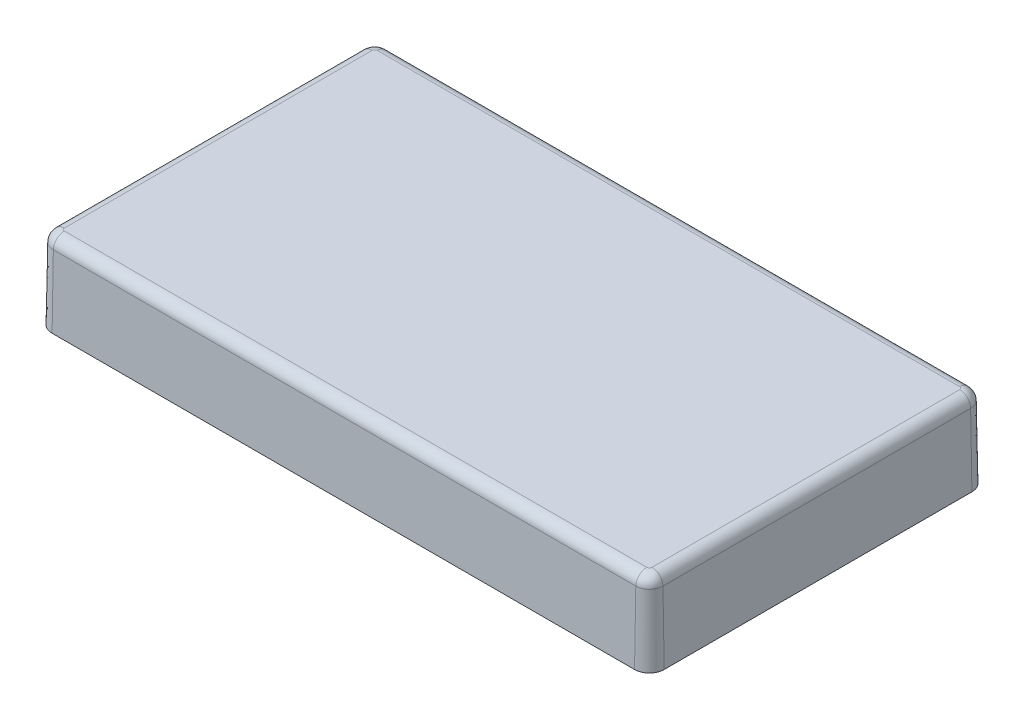
ISO-10303-21;
HEADER;
FILE_DESCRIPTION(('STEP AP214'),'2;1');
FILE_NAME('part.step','',(''),(''),'','','');
FILE_SCHEMA(('AUTOMOTIVE_DESIGN { 1 0 10303 214 1 1 1 1 }'));
ENDSEC;
DATA;
#1=APPLICATION_CONTEXT('core data for automotive mechanical design processes');
#2=APPLICATION_PROTOCOL_DEFINITION('international standard','automotive_design',2000,#1);
#3=PRODUCT_CONTEXT('',#1,'mechanical');
#4=PRODUCT('Part','Part','',(#3));
#5=PRODUCT_RELATED_PRODUCT_CATEGORY('part','',(#4));
#6=PRODUCT_DEFINITION_FORMATION('','',#4);
#7=PRODUCT_DEFINITION_CONTEXT('part definition',#1,'design');
#8=PRODUCT_DEFINITION('design','',#6,#7);
#9=PRODUCT_DEFINITION_SHAPE('','',#8);
#10=(LENGTH_UNIT() NAMED_UNIT(*) SI_UNIT(.MILLI.,.METRE.));
#11=(NAMED_UNIT(*) PLANE_ANGLE_UNIT() SI_UNIT($,.RADIAN.));
#12=(NAMED_UNIT(*) SI_UNIT($,.STERADIAN.) SOLID_ANGLE_UNIT());
#13=UNCERTAINTY_MEASURE_WITH_UNIT(LENGTH_MEASURE(1.E-05),#10,'distance_accuracy_value','');
#14=(GEOMETRIC_REPRESENTATION_CONTEXT(3) GLOBAL_UNCERTAINTY_ASSIGNED_CONTEXT((#13)) GLOBAL_UNIT_ASSIGNED_CONTEXT((#10,
#11,#12)) REPRESENTATION_CONTEXT('',''));
#15=CARTESIAN_POINT('',(0.,0.,0.));
#16=DIRECTION('',(0.,0.,1.));
#17=DIRECTION('',(1.,0.,0.));
#18=AXIS2_PLACEMENT_3D('',#15,#16,#17);
#19=CARTESIAN_POINT('',(0.,10.,0.));
#20=DIRECTION('',(0.,1.,0.));
#21=DIRECTION('',(0.,0.,1.));
#22=AXIS2_PLACEMENT_3D('',#19,#20,#21);
#23=PLANE('',#22);
#24=CARTESIAN_POINT('',(53.,10.,-28.));
#25=DIRECTION('',(0.,1.,0.));
#26=DIRECTION('',(0.,0.,1.));
#27=AXIS2_PLACEMENT_3D('',#24,#25,#26);
#28=CIRCLE('',#27,0.697897941040891);
#29=CARTESIAN_POINT('',(53.6978979410409,10.,-28.));
#30=VERTEX_POINT('',#29);
#31=CARTESIAN_POINT('',(53.,10.,-28.6978979410409));
#32=VERTEX_POINT('',#31);
#33=EDGE_CURVE('E307',#30,#32,#28,.T.);
#34=ORIENTED_EDGE('',*,*,#33,.T.);
#35=DIRECTION('',(1.,0.,0.));
#36=VECTOR('',#35,1.);
#37=CARTESIAN_POINT('',(-53.,10.,-28.6978979410409));
#38=LINE('',#37,#36);
#39=CARTESIAN_POINT('',(-53.,10.,-28.6978979410409));
#40=VERTEX_POINT('',#39);
#41=EDGE_CURVE('E304',#32,#40,#38,.F.);
#42=ORIENTED_EDGE('',*,*,#41,.T.);
#43=CARTESIAN_POINT('',(-53.,10.,-28.));
#44=DIRECTION('',(0.,1.,0.));
#45=DIRECTION('',(0.,0.,1.));
#46=AXIS2_PLACEMENT_3D('',#43,#44,#45);
#47=CIRCLE('',#46,0.697897941040895);
#48=CARTESIAN_POINT('',(-53.6978979410409,10.,-28.));
#49=VERTEX_POINT('',#48);
#50=EDGE_CURVE('E301',#40,#49,#47,.T.);
#51=ORIENTED_EDGE('',*,*,#50,.T.);
#52=DIRECTION('',(0.,0.,-1.));
#53=VECTOR('',#52,1.);
#54=CARTESIAN_POINT('',(-53.6978979410409,10.,-28.));
#55=LINE('',#54,#53);
#56=CARTESIAN_POINT('',(-53.6978979410409,10.,28.));
#57=VERTEX_POINT('',#56);
#58=EDGE_CURVE('E298',#49,#57,#55,.F.);
#59=ORIENTED_EDGE('',*,*,#58,.T.);
#60=CARTESIAN_POINT('',(-53.,10.,28.));
#61=DIRECTION('',(0.,1.,0.));
#62=DIRECTION('',(0.,0.,1.));
#63=AXIS2_PLACEMENT_3D('',#60,#61,#62);
#64=CIRCLE('',#63,0.697897941040895);
#65=CARTESIAN_POINT('',(-53.,10.,28.6978979410409));
#66=VERTEX_POINT('',#65);
#67=EDGE_CURVE('E295',#57,#66,#64,.T.);
#68=ORIENTED_EDGE('',*,*,#67,.T.);
#69=DIRECTION('',(-1.,0.,0.));
#70=VECTOR('',#69,1.);
#71=CARTESIAN_POINT('',(-53.,10.,28.6978979410409));
#72=LINE('',#71,#70);
#73=CARTESIAN_POINT('',(53.,10.,28.6978979410409));
#74=VERTEX_POINT('',#73);
#75=EDGE_CURVE('E292',#66,#74,#72,.F.);
#76=ORIENTED_EDGE('',*,*,#75,.T.);
#77=CARTESIAN_POINT('',(53.,10.,28.));
#78=DIRECTION('',(0.,1.,0.));
#79=DIRECTION('',(0.,0.,1.));
#80=AXIS2_PLACEMENT_3D('',#77,#78,#79);
#81=CIRCLE('',#80,0.697897941040891);
#82=CARTESIAN_POINT('',(53.6978979410409,10.,28.));
#83=VERTEX_POINT('',#82);
#84=EDGE_CURVE('E41',#74,#83,#81,.T.);
#85=ORIENTED_EDGE('',*,*,#84,.T.);
#86=DIRECTION('',(0.,0.,1.));
#87=VECTOR('',#86,1.);
#88=CARTESIAN_POINT('',(53.6978979410409,10.,-28.));
#89=LINE('',#88,#87);
#90=EDGE_CURVE('E11',#83,#30,#89,.F.);
#91=ORIENTED_EDGE('',*,*,#90,.T.);
#92=EDGE_LOOP('',(#34,#42,#51,#59,#68,#76,#85,#91));
#93=FACE_BOUND('',#92,.T.);
#94=DIRECTION('',(0.,0.,1.));
#95=VECTOR('',#94,1.);
#96=CARTESIAN_POINT('',(55.6982025971287,10.,-28.));
#97=LINE('',#96,#95);
#98=CARTESIAN_POINT('',(55.6982025971287,10.,28.));
#99=VERTEX_POINT('',#98);
#100=CARTESIAN_POINT('',(55.6982025971287,10.,-28.));
#101=VERTEX_POINT('',#100);
#102=EDGE_CURVE('E249',#99,#101,#97,.F.);
#103=ORIENTED_EDGE('',*,*,#102,.F.);
#104=CARTESIAN_POINT('',(53.,10.,28.));
#105=DIRECTION('',(0.,1.,0.));
#106=DIRECTION('',(0.,0.,1.));
#107=AXIS2_PLACEMENT_3D('',#104,#105,#106);
#108=CIRCLE('',#107,2.69820259712871);
#109=CARTESIAN_POINT('',(53.,10.,30.6982025971287));
#110=VERTEX_POINT('',#109);
#111=EDGE_CURVE('E311',#110,#99,#108,.T.);
#112=ORIENTED_EDGE('',*,*,#111,.F.);
#113=DIRECTION('',(-1.,0.,0.));
#114=VECTOR('',#113,1.);
#115=CARTESIAN_POINT('',(-53.,10.,30.6982025971287));
#116=LINE('',#115,#114);
#117=CARTESIAN_POINT('',(-53.,10.,30.6982025971287));
#118=VERTEX_POINT('',#117);
#119=EDGE_CURVE('E313',#118,#110,#116,.F.);
#120=ORIENTED_EDGE('',*,*,#119,.F.);
#121=CARTESIAN_POINT('',(-53.,10.,28.));
#122=DIRECTION('',(0.,1.,0.));
#123=DIRECTION('',(0.,0.,1.));
#124=AXIS2_PLACEMENT_3D('',#121,#122,#123);
#125=CIRCLE('',#124,2.69820259712871);
#126=CARTESIAN_POINT('',(-55.6982025971287,10.,28.));
#127=VERTEX_POINT('',#126);
#128=EDGE_CURVE('E315',#127,#118,#125,.T.);
#129=ORIENTED_EDGE('',*,*,#128,.F.);
#130=DIRECTION('',(0.,0.,-1.));
#131=VECTOR('',#130,1.);
#132=CARTESIAN_POINT('',(-55.6982025971287,10.,-28.));
#133=LINE('',#132,#131);
#134=CARTESIAN_POINT('',(-55.6982025971287,10.,-28.));
#135=VERTEX_POINT('',#134);
#136=EDGE_CURVE('E317',#135,#127,#133,.F.);
#137=ORIENTED_EDGE('',*,*,#136,.F.);
#138=CARTESIAN_POINT('',(-53.,10.,-28.));
#139=DIRECTION('',(0.,1.,0.));
#140=DIRECTION('',(0.,0.,1.));
#141=AXIS2_PLACEMENT_3D('',#138,#139,#140);
#142=CIRCLE('',#141,2.69820259712871);
#143=CARTESIAN_POINT('',(-53.,10.,-30.6982025971287));
#144=VERTEX_POINT('',#143);
#145=EDGE_CURVE('E319',#144,#135,#142,.T.);
#146=ORIENTED_EDGE('',*,*,#145,.F.);
#147=DIRECTION('',(1.,0.,0.));
#148=VECTOR('',#147,1.);
#149=CARTESIAN_POINT('',(-53.,10.,-30.6982025971287));
#150=LINE('',#149,#148);
#151=CARTESIAN_POINT('',(53.,10.,-30.6982025971287));
#152=VERTEX_POINT('',#151);
#153=EDGE_CURVE('E320',#152,#144,#150,.F.);
#154=ORIENTED_EDGE('',*,*,#153,.F.);
#155=CARTESIAN_POINT('',(53.,10.,-28.));
#156=DIRECTION('',(0.,1.,0.));
#157=DIRECTION('',(0.,0.,1.));
#158=AXIS2_PLACEMENT_3D('',#155,#156,#157);
#159=CIRCLE('',#158,2.69820259712871);
#160=EDGE_CURVE('E36',#101,#152,#159,.T.);
#161=ORIENTED_EDGE('',*,*,#160,.F.);
#162=EDGE_LOOP('',(#103,#112,#120,#129,#137,#146,#154,#161));
#163=FACE_BOUND('',#162,.T.);
#164=ADVANCED_FACE('F33',(#93,#163),#23,.F.);
#165=CARTESIAN_POINT('',(53.,24.9650951871254,-28.));
#166=DIRECTION('',(0.,-1.,0.));
#167=DIRECTION('',(0.,0.,1.));
#168=AXIS2_PLACEMENT_3D('',#165,#166,#167);
#169=CONICAL_SURFACE('',#168,0.43668123289266,0.0174532925199433);
#170=ORIENTED_EDGE('',*,*,#33,.F.);
#171=DIRECTION('',(0.0174524064372835,-0.999847695156391,0.));
#172=VECTOR('',#171,1.);
#173=CARTESIAN_POINT('',(53.4366812328927,24.9650951871254,-28.));
#174=LINE('',#173,#172);
#175=CARTESIAN_POINT('',(53.4709820969741,23.,-28.));
#176=VERTEX_POINT('',#175);
#177=EDGE_CURVE('E287',#176,#30,#174,.T.);
#178=ORIENTED_EDGE('',*,*,#177,.F.);
#179=CARTESIAN_POINT('',(53.,23.,-28.));
#180=DIRECTION('',(0.,1.,0.));
#181=DIRECTION('',(0.,0.,1.));
#182=AXIS2_PLACEMENT_3D('',#179,#180,#181);
#183=CIRCLE('',#182,0.470982096974062);
#184=CARTESIAN_POINT('',(53.,23.,-28.4709820969741));
#185=VERTEX_POINT('',#184);
#186=EDGE_CURVE('E231',#185,#176,#183,.F.);
#187=ORIENTED_EDGE('',*,*,#186,.F.);
#188=DIRECTION('',(0.,0.999847695156391,0.0174524064372835));
#189=VECTOR('',#188,1.);
#190=CARTESIAN_POINT('',(53.,24.9650951871254,-28.4366812328927));
#191=LINE('',#190,#189);
#192=EDGE_CURVE('E281',#185,#32,#191,.F.);
#193=ORIENTED_EDGE('',*,*,#192,.T.);
#194=EDGE_LOOP('',(#170,#178,#187,#193));
#195=FACE_BOUND('',#194,.T.);
#196=ADVANCED_FACE('F407',(#195),#169,.F.);
#197=CARTESIAN_POINT('',(-53.,24.9650951871254,-28.4366812328927));
#198=DIRECTION('',(0.,0.0174524064372835,-0.999847695156391));
#199=DIRECTION('',(0.,0.999847695156391,0.0174524064372835));
#200=AXIS2_PLACEMENT_3D('',#197,#198,#199);
#201=PLANE('',#200);
#202=ORIENTED_EDGE('',*,*,#41,.F.);
#203=ORIENTED_EDGE('',*,*,#192,.F.);
#204=DIRECTION('',(-1.,0.,0.));
#205=VECTOR('',#204,1.);
#206=CARTESIAN_POINT('',(53.,23.,-28.4709820969741));
#207=LINE('',#206,#205);
#208=CARTESIAN_POINT('',(-53.,23.,-28.4709820969741));
#209=VERTEX_POINT('',#208);
#210=EDGE_CURVE('E284',#209,#185,#207,.F.);
#211=ORIENTED_EDGE('',*,*,#210,.F.);
#212=DIRECTION('',(0.,-0.999847695156391,-0.0174524064372835));
#213=VECTOR('',#212,1.);
#214=CARTESIAN_POINT('',(-53.,24.9650951871254,-28.4366812328927));
#215=LINE('',#214,#213);
#216=EDGE_CURVE('E275',#209,#40,#215,.T.);
#217=ORIENTED_EDGE('',*,*,#216,.T.);
#218=EDGE_LOOP('',(#202,#203,#211,#217));
#219=FACE_BOUND('',#218,.T.);
#220=ADVANCED_FACE('F411',(#219),#201,.F.);
#221=CARTESIAN_POINT('',(-53.,24.9650951871254,-28.));
#222=DIRECTION('',(0.,-1.,0.));
#223=DIRECTION('',(0.,0.,1.));
#224=AXIS2_PLACEMENT_3D('',#221,#222,#223);
#225=CONICAL_SURFACE('',#224,0.436681232892663,0.0174532925199433);
#226=ORIENTED_EDGE('',*,*,#50,.F.);
#227=ORIENTED_EDGE('',*,*,#216,.F.);
#228=CARTESIAN_POINT('',(-53.,23.,-28.));
#229=DIRECTION('',(0.,1.,0.));
#230=DIRECTION('',(0.,0.,1.));
#231=AXIS2_PLACEMENT_3D('',#228,#229,#230);
#232=CIRCLE('',#231,0.470982096974066);
#233=CARTESIAN_POINT('',(-53.4709820969741,23.,-28.));
#234=VERTEX_POINT('',#233);
#235=EDGE_CURVE('E278',#234,#209,#232,.F.);
#236=ORIENTED_EDGE('',*,*,#235,.F.);
#237=DIRECTION('',(-0.0174524064372835,-0.999847695156391,0.));
#238=VECTOR('',#237,1.);
#239=CARTESIAN_POINT('',(-53.4366812328927,24.9650951871254,-28.));
#240=LINE('',#239,#238);
#241=EDGE_CURVE('E269',#234,#49,#240,.T.);
#242=ORIENTED_EDGE('',*,*,#241,.T.);
#243=EDGE_LOOP('',(#226,#227,#236,#242));
#244=FACE_BOUND('',#243,.T.);
#245=ADVANCED_FACE('F438',(#244),#225,.F.);
#246=CARTESIAN_POINT('',(-53.4366812328927,24.9650951871254,-28.));
#247=DIRECTION('',(-0.999847695156391,0.0174524064372835,0.));
#248=DIRECTION('',(-0.0174524064372835,-0.999847695156391,0.));
#249=AXIS2_PLACEMENT_3D('',#246,#247,#248);
#250=PLANE('',#249);
#251=ORIENTED_EDGE('',*,*,#58,.F.);
#252=ORIENTED_EDGE('',*,*,#241,.F.);
#253=DIRECTION('',(0.,0.,1.));
#254=VECTOR('',#253,1.);
#255=CARTESIAN_POINT('',(-53.4709820969741,23.,-28.));
#256=LINE('',#255,#254);
#257=CARTESIAN_POINT('',(-53.4709820969741,23.,28.));
#258=VERTEX_POINT('',#257);
#259=EDGE_CURVE('E272',#258,#234,#256,.F.);
#260=ORIENTED_EDGE('',*,*,#259,.F.);
#261=DIRECTION('',(-0.0174524064372835,-0.999847695156391,0.));
#262=VECTOR('',#261,1.);
#263=CARTESIAN_POINT('',(-53.4366812328927,24.9650951871254,28.));
#264=LINE('',#263,#262);
#265=EDGE_CURVE('E263',#258,#57,#264,.T.);
#266=ORIENTED_EDGE('',*,*,#265,.T.);
#267=EDGE_LOOP('',(#251,#252,#260,#266));
#268=FACE_BOUND('',#267,.T.);
#269=ADVANCED_FACE('F442',(#268),#250,.F.);
#270=CARTESIAN_POINT('',(-53.,24.9650951871254,28.));
#271=DIRECTION('',(0.,-1.,0.));
#272=DIRECTION('',(0.,0.,1.));
#273=AXIS2_PLACEMENT_3D('',#270,#271,#272);
#274=CONICAL_SURFACE('',#273,0.436681232892663,0.0174532925199433);
#275=ORIENTED_EDGE('',*,*,#67,.F.);
#276=ORIENTED_EDGE('',*,*,#265,.F.);
#277=CARTESIAN_POINT('',(-53.,23.,28.));
#278=DIRECTION('',(0.,1.,0.));
#279=DIRECTION('',(0.,0.,1.));
#280=AXIS2_PLACEMENT_3D('',#277,#278,#279);
#281=CIRCLE('',#280,0.470982096974066);
#282=CARTESIAN_POINT('',(-53.,23.,28.4709820969741));
#283=VERTEX_POINT('',#282);
#284=EDGE_CURVE('E266',#283,#258,#281,.F.);
#285=ORIENTED_EDGE('',*,*,#284,.F.);
#286=DIRECTION('',(0.,-0.999847695156391,0.0174524064372835));
#287=VECTOR('',#286,1.);
#288=CARTESIAN_POINT('',(-53.,24.9650951871254,28.4366812328927));
#289=LINE('',#288,#287);
#290=EDGE_CURVE('E260',#283,#66,#289,.T.);
#291=ORIENTED_EDGE('',*,*,#290,.T.);
#292=EDGE_LOOP('',(#275,#276,#285,#291));
#293=FACE_BOUND('',#292,.T.);
#294=ADVANCED_FACE('F446',(#293),#274,.F.);
#295=CARTESIAN_POINT('',(-53.,24.9650951871254,28.4366812328927));
#296=DIRECTION('',(0.,0.0174524064372835,0.999847695156391));
#297=DIRECTION('',(0.,-0.999847695156391,0.0174524064372835));
#298=AXIS2_PLACEMENT_3D('',#295,#296,#297);
#299=PLANE('',#298);
#300=ORIENTED_EDGE('',*,*,#75,.F.);
#301=ORIENTED_EDGE('',*,*,#290,.F.);
#302=DIRECTION('',(-1.,0.,0.));
#303=VECTOR('',#302,1.);
#304=CARTESIAN_POINT('',(-53.,23.,28.4709820969741));
#305=LINE('',#304,#303);
#306=CARTESIAN_POINT('',(53.,23.,28.4709820969741));
#307=VERTEX_POINT('',#306);
#308=EDGE_CURVE('E252',#283,#307,#305,.F.);
#309=ORIENTED_EDGE('',*,*,#308,.T.);
#310=DIRECTION('',(0.,-0.999847695156391,0.0174524064372835));
#311=VECTOR('',#310,1.);
#312=CARTESIAN_POINT('',(53.,24.9650951871254,28.4366812328927));
#313=LINE('',#312,#311);
#314=EDGE_CURVE('E257',#307,#74,#313,.T.);
#315=ORIENTED_EDGE('',*,*,#314,.T.);
#316=EDGE_LOOP('',(#300,#301,#309,#315));
#317=FACE_BOUND('',#316,.T.);
#318=ADVANCED_FACE('F450',(#317),#299,.F.);
#319=CARTESIAN_POINT('',(53.,24.9650951871254,28.));
#320=DIRECTION('',(0.,-1.,0.));
#321=DIRECTION('',(0.,0.,1.));
#322=AXIS2_PLACEMENT_3D('',#319,#320,#321);
#323=CONICAL_SURFACE('',#322,0.43668123289266,0.0174532925199433);
#324=ORIENTED_EDGE('',*,*,#84,.F.);
#325=ORIENTED_EDGE('',*,*,#314,.F.);
#326=CARTESIAN_POINT('',(53.,23.,28.));
#327=DIRECTION('',(0.,1.,0.));
#328=DIRECTION('',(0.,0.,1.));
#329=AXIS2_PLACEMENT_3D('',#326,#327,#328);
#330=CIRCLE('',#329,0.470982096974062);
#331=CARTESIAN_POINT('',(53.4709820969741,23.,28.));
#332=VERTEX_POINT('',#331);
#333=EDGE_CURVE('E250',#307,#332,#330,.T.);
#334=ORIENTED_EDGE('',*,*,#333,.T.);
#335=DIRECTION('',(-0.0174524064372835,0.999847695156391,0.));
#336=VECTOR('',#335,1.);
#337=CARTESIAN_POINT('',(53.4366812328927,24.9650951871254,28.));
#338=LINE('',#337,#336);
#339=EDGE_CURVE('E254',#332,#83,#338,.F.);
#340=ORIENTED_EDGE('',*,*,#339,.T.);
#341=EDGE_LOOP('',(#324,#325,#334,#340));
#342=FACE_BOUND('',#341,.T.);
#343=ADVANCED_FACE('F454',(#342),#323,.F.);
#344=CARTESIAN_POINT('',(53.4366812328927,24.9650951871254,-28.));
#345=DIRECTION('',(0.999847695156391,0.0174524064372835,0.));
#346=DIRECTION('',(-0.0174524064372835,0.999847695156391,0.));
#347=AXIS2_PLACEMENT_3D('',#344,#345,#346);
#348=PLANE('',#347);
#349=ORIENTED_EDGE('',*,*,#90,.F.);
#350=ORIENTED_EDGE('',*,*,#339,.F.);
#351=DIRECTION('',(0.,0.,1.));
#352=VECTOR('',#351,1.);
#353=CARTESIAN_POINT('',(53.4709820969741,23.,-28.));
#354=LINE('',#353,#352);
#355=EDGE_CURVE('E247',#332,#176,#354,.F.);
#356=ORIENTED_EDGE('',*,*,#355,.T.);
#357=ORIENTED_EDGE('',*,*,#177,.T.);
#358=EDGE_LOOP('',(#349,#350,#356,#357));
#359=FACE_BOUND('',#358,.T.);
#360=ADVANCED_FACE('F458',(#359),#348,.F.);
#361=CARTESIAN_POINT('',(53.,23.,-28.));
#362=DIRECTION('',(0.,1.,0.));
#363=DIRECTION('',(0.,0.,1.));
#364=AXIS2_PLACEMENT_3D('',#361,#362,#363);
#365=PLANE('',#364);
#366=ORIENTED_EDGE('',*,*,#259,.T.);
#367=ORIENTED_EDGE('',*,*,#235,.T.);
#368=ORIENTED_EDGE('',*,*,#210,.T.);
#369=ORIENTED_EDGE('',*,*,#186,.T.);
#370=ORIENTED_EDGE('',*,*,#355,.F.);
#371=ORIENTED_EDGE('',*,*,#333,.F.);
#372=ORIENTED_EDGE('',*,*,#308,.F.);
#373=ORIENTED_EDGE('',*,*,#284,.T.);
#374=EDGE_LOOP('',(#366,#367,#368,#369,#370,#371,#372,#373));
#375=FACE_BOUND('',#374,.T.);
#376=ADVANCED_FACE('F461',(#375),#365,.F.);
#377=CARTESIAN_POINT('',(53.,25.,-28.));
#378=DIRECTION('',(0.,1.,0.));
#379=DIRECTION('',(0.,0.,1.));
#380=AXIS2_PLACEMENT_3D('',#377,#378,#379);
#381=PLANE('',#380);
#382=DIRECTION('',(0.,0.,-1.));
#383=VECTOR('',#382,1.);
#384=CARTESIAN_POINT('',(-53.4709820969741,25.,28.));
#385=LINE('',#384,#383);
#386=CARTESIAN_POINT('',(-53.4709820969741,25.,-28.));
#387=VERTEX_POINT('',#386);
#388=CARTESIAN_POINT('',(-53.4709820969741,25.,28.));
#389=VERTEX_POINT('',#388);
#390=EDGE_CURVE('E206',#387,#389,#385,.F.);
#391=ORIENTED_EDGE('',*,*,#390,.T.);
#392=CARTESIAN_POINT('',(-53.,25.,28.));
#393=DIRECTION('',(0.,1.,0.));
#394=DIRECTION('',(0.,0.,1.));
#395=AXIS2_PLACEMENT_3D('',#392,#393,#394);
#396=CIRCLE('',#395,0.470982096974066);
#397=CARTESIAN_POINT('',(-53.,25.,28.4709820969741));
#398=VERTEX_POINT('',#397);
#399=EDGE_CURVE('E212',#389,#398,#396,.T.);
#400=ORIENTED_EDGE('',*,*,#399,.T.);
#401=DIRECTION('',(-1.,0.,0.));
#402=VECTOR('',#401,1.);
#403=CARTESIAN_POINT('',(53.,25.,28.4709820969741));
#404=LINE('',#403,#402);
#405=CARTESIAN_POINT('',(53.,25.,28.4709820969741));
#406=VERTEX_POINT('',#405);
#407=EDGE_CURVE('E210',#398,#406,#404,.F.);
#408=ORIENTED_EDGE('',*,*,#407,.T.);
#409=CARTESIAN_POINT('',(53.,25.,28.));
#410=DIRECTION('',(0.,1.,0.));
#411=DIRECTION('',(0.,0.,1.));
#412=AXIS2_PLACEMENT_3D('',#409,#410,#411);
#413=CIRCLE('',#412,0.470982096974062);
#414=CARTESIAN_POINT('',(53.4709820969741,25.,28.));
#415=VERTEX_POINT('',#414);
#416=EDGE_CURVE('E208',#406,#415,#413,.T.);
#417=ORIENTED_EDGE('',*,*,#416,.T.);
#418=DIRECTION('',(0.,0.,1.));
#419=VECTOR('',#418,1.);
#420=CARTESIAN_POINT('',(53.4709820969741,25.,-28.));
#421=LINE('',#420,#419);
#422=CARTESIAN_POINT('',(53.4709820969741,25.,-28.));
#423=VERTEX_POINT('',#422);
#424=EDGE_CURVE('E175',#415,#423,#421,.F.);
#425=ORIENTED_EDGE('',*,*,#424,.T.);
#426=CARTESIAN_POINT('',(53.,25.,-28.));
#427=DIRECTION('',(0.,1.,0.));
#428=DIRECTION('',(0.,0.,1.));
#429=AXIS2_PLACEMENT_3D('',#426,#427,#428);
#430=CIRCLE('',#429,0.470982096974062);
#431=CARTESIAN_POINT('',(53.,25.,-28.4709820969741));
#432=VERTEX_POINT('',#431);
#433=EDGE_CURVE('E168',#423,#432,#430,.T.);
#434=ORIENTED_EDGE('',*,*,#433,.T.);
#435=DIRECTION('',(1.,0.,0.));
#436=VECTOR('',#435,1.);
#437=CARTESIAN_POINT('',(-53.,25.,-28.4709820969741));
#438=LINE('',#437,#436);
#439=CARTESIAN_POINT('',(-53.,25.,-28.4709820969741));
#440=VERTEX_POINT('',#439);
#441=EDGE_CURVE('E172',#432,#440,#438,.F.);
#442=ORIENTED_EDGE('',*,*,#441,.T.);
#443=CARTESIAN_POINT('',(-53.,25.,-28.));
#444=DIRECTION('',(0.,1.,0.));
#445=DIRECTION('',(0.,0.,1.));
#446=AXIS2_PLACEMENT_3D('',#443,#444,#445);
#447=CIRCLE('',#446,0.470982096974066);
#448=EDGE_CURVE('E179',#440,#387,#447,.T.);
#449=ORIENTED_EDGE('',*,*,#448,.T.);
#450=EDGE_LOOP('',(#391,#400,#408,#417,#425,#434,#442,#449));
#451=FACE_BOUND('',#450,.T.);
#452=ADVANCED_FACE('F170',(#451),#381,.T.);
#453=CARTESIAN_POINT('',(53.,23.,-28.));
#454=DIRECTION('',(0.,1.,0.));
#455=DIRECTION('',(0.,0.,1.));
#456=AXIS2_PLACEMENT_3D('',#453,#454,#455);
#457=DEGENERATE_TOROIDAL_SURFACE('',#456,0.470982096974062,2.,.T.);
#458=CARTESIAN_POINT('',(53.4709820969741,23.,-28.));
#459=DIRECTION('',(0.,0.,1.));
#460=DIRECTION('',(1.,0.,0.));
#461=AXIS2_PLACEMENT_3D('',#458,#459,#460);
#462=CIRCLE('',#461,2.);
#463=CARTESIAN_POINT('',(55.4706774872868,23.0349048128746,-28.));
#464=VERTEX_POINT('',#463);
#465=EDGE_CURVE('E189',#464,#423,#462,.T.);
#466=ORIENTED_EDGE('',*,*,#465,.F.);
#467=CARTESIAN_POINT('',(53.,23.0349048128746,-28.));
#468=DIRECTION('',(0.,-1.,0.));
#469=DIRECTION('',(0.,0.,-1.));
#470=AXIS2_PLACEMENT_3D('',#467,#468,#469);
#471=CIRCLE('',#470,2.47067748728684);
#472=CARTESIAN_POINT('',(53.,23.0349048128746,-30.4706774872868));
#473=VERTEX_POINT('',#472);
#474=EDGE_CURVE('E185',#473,#464,#471,.T.);
#475=ORIENTED_EDGE('',*,*,#474,.F.);
#476=CARTESIAN_POINT('',(53.,23.,-28.4709820969741));
#477=DIRECTION('',(-1.,0.,0.));
#478=DIRECTION('',(0.,0.,1.));
#479=AXIS2_PLACEMENT_3D('',#476,#477,#478);
#480=CIRCLE('',#479,2.);
#481=EDGE_CURVE('E183',#432,#473,#480,.T.);
#482=ORIENTED_EDGE('',*,*,#481,.F.);
#483=ORIENTED_EDGE('',*,*,#433,.F.);
#484=EDGE_LOOP('',(#466,#475,#482,#483));
#485=FACE_BOUND('',#484,.T.);
#486=ADVANCED_FACE('F184',(#485),#457,.T.);
#487=CARTESIAN_POINT('',(53.,23.,-28.4709820969741));
#488=DIRECTION('',(-1.,0.,0.));
#489=DIRECTION('',(0.,0.,1.));
#490=AXIS2_PLACEMENT_3D('',#487,#488,#489);
#491=CYLINDRICAL_SURFACE('',#490,2.);
#492=ORIENTED_EDGE('',*,*,#481,.T.);
#493=DIRECTION('',(-1.,0.,0.));
#494=VECTOR('',#493,1.);
#495=CARTESIAN_POINT('',(53.,23.0349048128746,-30.4706774872868));
#496=LINE('',#495,#494);
#497=CARTESIAN_POINT('',(-53.,23.0349048128746,-30.4706774872868));
#498=VERTEX_POINT('',#497);
#499=EDGE_CURVE('E229',#498,#473,#496,.F.);
#500=ORIENTED_EDGE('',*,*,#499,.F.);
#501=CARTESIAN_POINT('',(-53.,23.,-28.4709820969741));
#502=DIRECTION('',(-1.,0.,0.));
#503=DIRECTION('',(0.,0.,1.));
#504=AXIS2_PLACEMENT_3D('',#501,#502,#503);
#505=CIRCLE('',#504,2.);
#506=EDGE_CURVE('E193',#440,#498,#505,.T.);
#507=ORIENTED_EDGE('',*,*,#506,.F.);
#508=ORIENTED_EDGE('',*,*,#441,.F.);
#509=EDGE_LOOP('',(#492,#500,#507,#508));
#510=FACE_BOUND('',#509,.T.);
#511=ADVANCED_FACE('F191',(#510),#491,.T.);
#512=CARTESIAN_POINT('',(-53.,23.,-28.));
#513=DIRECTION('',(0.,1.,0.));
#514=DIRECTION('',(0.,0.,1.));
#515=AXIS2_PLACEMENT_3D('',#512,#513,#514);
#516=DEGENERATE_TOROIDAL_SURFACE('',#515,0.470982096974066,2.,.T.);
#517=ORIENTED_EDGE('',*,*,#506,.T.);
#518=CARTESIAN_POINT('',(-53.,23.0349048128746,-28.));
#519=DIRECTION('',(0.,-1.,0.));
#520=DIRECTION('',(0.,0.,-1.));
#521=AXIS2_PLACEMENT_3D('',#518,#519,#520);
#522=CIRCLE('',#521,2.47067748728685);
#523=CARTESIAN_POINT('',(-55.4706774872869,23.0349048128746,-28.));
#524=VERTEX_POINT('',#523);
#525=EDGE_CURVE('E223',#524,#498,#522,.T.);
#526=ORIENTED_EDGE('',*,*,#525,.F.);
#527=CARTESIAN_POINT('',(-53.4709820969741,23.,-28.));
#528=DIRECTION('',(0.,0.,1.));
#529=DIRECTION('',(1.,0.,0.));
#530=AXIS2_PLACEMENT_3D('',#527,#528,#529);
#531=CIRCLE('',#530,2.);
#532=EDGE_CURVE('E239',#387,#524,#531,.T.);
#533=ORIENTED_EDGE('',*,*,#532,.F.);
#534=ORIENTED_EDGE('',*,*,#448,.F.);
#535=EDGE_LOOP('',(#517,#526,#533,#534));
#536=FACE_BOUND('',#535,.T.);
#537=ADVANCED_FACE('F337',(#536),#516,.T.);
#538=CARTESIAN_POINT('',(-53.,25.,-30.4363766232054));
#539=DIRECTION('',(0.,0.0174524064372835,-0.999847695156391));
#540=DIRECTION('',(0.,0.999847695156391,0.0174524064372835));
#541=AXIS2_PLACEMENT_3D('',#538,#539,#540);
#542=PLANE('',#541);
#543=DIRECTION('',(0.,-0.999847695156391,-0.0174524064372835));
#544=VECTOR('',#543,1.);
#545=CARTESIAN_POINT('',(53.,25.,-30.4363766232054));
#546=LINE('',#545,#544);
#547=EDGE_CURVE('E195',#473,#152,#546,.T.);
#548=ORIENTED_EDGE('',*,*,#547,.T.);
#549=ORIENTED_EDGE('',*,*,#153,.T.);
#550=DIRECTION('',(0.,-0.999847695156391,-0.0174524064372835));
#551=VECTOR('',#550,1.);
#552=CARTESIAN_POINT('',(-53.,25.,-30.4363766232054));
#553=LINE('',#552,#551);
#554=EDGE_CURVE('E199',#498,#144,#553,.T.);
#555=ORIENTED_EDGE('',*,*,#554,.F.);
#556=ORIENTED_EDGE('',*,*,#499,.T.);
#557=EDGE_LOOP('',(#548,#549,#555,#556));
#558=FACE_BOUND('',#557,.T.);
#559=ADVANCED_FACE('F334',(#558),#542,.T.);
#560=CARTESIAN_POINT('',(-53.4709820969741,23.,-28.));
#561=DIRECTION('',(0.,0.,1.));
#562=DIRECTION('',(1.,0.,0.));
#563=AXIS2_PLACEMENT_3D('',#560,#561,#562);
#564=CYLINDRICAL_SURFACE('',#563,2.);
#565=ORIENTED_EDGE('',*,*,#532,.T.);
#566=DIRECTION('',(0.,0.,1.));
#567=VECTOR('',#566,1.);
#568=CARTESIAN_POINT('',(-55.4706774872869,23.0349048128746,-28.));
#569=LINE('',#568,#567);
#570=CARTESIAN_POINT('',(-55.4706774872868,23.0349048128746,28.));
#571=VERTEX_POINT('',#570);
#572=EDGE_CURVE('E225',#571,#524,#569,.F.);
#573=ORIENTED_EDGE('',*,*,#572,.F.);
#574=CARTESIAN_POINT('',(-53.4709820969741,23.,28.));
#575=DIRECTION('',(0.,0.,1.));
#576=DIRECTION('',(1.,0.,0.));
#577=AXIS2_PLACEMENT_3D('',#574,#575,#576);
#578=CIRCLE('',#577,2.);
#579=EDGE_CURVE('E234',#389,#571,#578,.T.);
#580=ORIENTED_EDGE('',*,*,#579,.F.);
#581=ORIENTED_EDGE('',*,*,#390,.F.);
#582=EDGE_LOOP('',(#565,#573,#580,#581));
#583=FACE_BOUND('',#582,.T.);
#584=ADVANCED_FACE('F344',(#583),#564,.T.);
#585=CARTESIAN_POINT('',(-53.,25.,-28.));
#586=DIRECTION('',(0.,-1.,0.));
#587=DIRECTION('',(0.,0.,1.));
#588=AXIS2_PLACEMENT_3D('',#585,#586,#587);
#589=CONICAL_SURFACE('',#588,2.43637662320545,0.0174532925199433);
#590=ORIENTED_EDGE('',*,*,#554,.T.);
#591=ORIENTED_EDGE('',*,*,#145,.T.);
#592=DIRECTION('',(-0.0174524064372835,-0.999847695156391,0.));
#593=VECTOR('',#592,1.);
#594=CARTESIAN_POINT('',(-55.4363766232055,25.,-28.));
#595=LINE('',#594,#593);
#596=EDGE_CURVE('E376',#524,#135,#595,.T.);
#597=ORIENTED_EDGE('',*,*,#596,.F.);
#598=ORIENTED_EDGE('',*,*,#525,.T.);
#599=EDGE_LOOP('',(#590,#591,#597,#598));
#600=FACE_BOUND('',#599,.T.);
#601=ADVANCED_FACE('F395',(#600),#589,.T.);
#602=CARTESIAN_POINT('',(-53.,23.,28.));
#603=DIRECTION('',(0.,1.,0.));
#604=DIRECTION('',(0.,0.,1.));
#605=AXIS2_PLACEMENT_3D('',#602,#603,#604);
#606=DEGENERATE_TOROIDAL_SURFACE('',#605,0.470982096974066,2.,.T.);
#607=ORIENTED_EDGE('',*,*,#579,.T.);
#608=CARTESIAN_POINT('',(-53.,23.0349048128746,28.));
#609=DIRECTION('',(0.,-1.,0.));
#610=DIRECTION('',(0.,0.,-1.));
#611=AXIS2_PLACEMENT_3D('',#608,#609,#610);
#612=CIRCLE('',#611,2.47067748728685);
#613=CARTESIAN_POINT('',(-53.,23.0349048128746,30.4706774872868));
#614=VERTEX_POINT('',#613);
#615=EDGE_CURVE('E215',#614,#571,#612,.T.);
#616=ORIENTED_EDGE('',*,*,#615,.F.);
#617=CARTESIAN_POINT('',(-53.,23.,28.4709820969741));
#618=DIRECTION('',(-1.,0.,0.));
#619=DIRECTION('',(0.,-1.,0.));
#620=AXIS2_PLACEMENT_3D('',#617,#618,#619);
#621=CIRCLE('',#620,2.);
#622=EDGE_CURVE('E232',#614,#398,#621,.T.);
#623=ORIENTED_EDGE('',*,*,#622,.T.);
#624=ORIENTED_EDGE('',*,*,#399,.F.);
#625=EDGE_LOOP('',(#607,#616,#623,#624));
#626=FACE_BOUND('',#625,.T.);
#627=ADVANCED_FACE('F347',(#626),#606,.T.);
#628=CARTESIAN_POINT('',(-55.4363766232055,25.,-28.));
#629=DIRECTION('',(-0.999847695156391,0.0174524064372835,0.));
#630=DIRECTION('',(-0.0174524064372835,-0.999847695156391,0.));
#631=AXIS2_PLACEMENT_3D('',#628,#629,#630);
#632=PLANE('',#631);
#633=ORIENTED_EDGE('',*,*,#596,.T.);
#634=ORIENTED_EDGE('',*,*,#136,.T.);
#635=DIRECTION('',(-0.0174524064372835,-0.999847695156391,0.));
#636=VECTOR('',#635,1.);
#637=CARTESIAN_POINT('',(-55.4363766232054,25.,28.));
#638=LINE('',#637,#636);
#639=EDGE_CURVE('E379',#571,#127,#638,.T.);
#640=ORIENTED_EDGE('',*,*,#639,.F.);
#641=ORIENTED_EDGE('',*,*,#572,.T.);
#642=EDGE_LOOP('',(#633,#634,#640,#641));
#643=FACE_BOUND('',#642,.T.);
#644=ADVANCED_FACE('F393',(#643),#632,.T.);
#645=CARTESIAN_POINT('',(53.,23.,28.4709820969741));
#646=DIRECTION('',(1.,0.,0.));
#647=DIRECTION('',(0.,0.,-1.));
#648=AXIS2_PLACEMENT_3D('',#645,#646,#647);
#649=CYLINDRICAL_SURFACE('',#648,2.);
#650=CARTESIAN_POINT('',(53.,23.,28.4709820969741));
#651=DIRECTION('',(-1.,0.,0.));
#652=DIRECTION('',(0.,0.,1.));
#653=AXIS2_PLACEMENT_3D('',#650,#651,#652);
#654=CIRCLE('',#653,2.);
#655=CARTESIAN_POINT('',(53.,23.0349048128746,30.4706774872868));
#656=VERTEX_POINT('',#655);
#657=EDGE_CURVE('E236',#656,#406,#654,.T.);
#658=ORIENTED_EDGE('',*,*,#657,.T.);
#659=ORIENTED_EDGE('',*,*,#407,.F.);
#660=ORIENTED_EDGE('',*,*,#622,.F.);
#661=DIRECTION('',(1.,0.,0.));
#662=VECTOR('',#661,1.);
#663=CARTESIAN_POINT('',(-53.,23.0349048128746,30.4706774872869));
#664=LINE('',#663,#662);
#665=EDGE_CURVE('E218',#656,#614,#664,.F.);
#666=ORIENTED_EDGE('',*,*,#665,.F.);
#667=EDGE_LOOP('',(#658,#659,#660,#666));
#668=FACE_BOUND('',#667,.T.);
#669=ADVANCED_FACE('F352',(#668),#649,.T.);
#670=CARTESIAN_POINT('',(-53.,25.,28.));
#671=DIRECTION('',(0.,-1.,0.));
#672=DIRECTION('',(0.,0.,1.));
#673=AXIS2_PLACEMENT_3D('',#670,#671,#672);
#674=CONICAL_SURFACE('',#673,2.43637662320545,0.0174532925199433);
#675=ORIENTED_EDGE('',*,*,#639,.T.);
#676=ORIENTED_EDGE('',*,*,#128,.T.);
#677=DIRECTION('',(0.,-0.999847695156391,0.0174524064372835));
#678=VECTOR('',#677,1.);
#679=CARTESIAN_POINT('',(-53.,25.,30.4363766232054));
#680=LINE('',#679,#678);
#681=EDGE_CURVE('E372',#614,#118,#680,.T.);
#682=ORIENTED_EDGE('',*,*,#681,.F.);
#683=ORIENTED_EDGE('',*,*,#615,.T.);
#684=EDGE_LOOP('',(#675,#676,#682,#683));
#685=FACE_BOUND('',#684,.T.);
#686=ADVANCED_FACE('F388',(#685),#674,.T.);
#687=CARTESIAN_POINT('',(53.,23.,28.));
#688=DIRECTION('',(0.,1.,0.));
#689=DIRECTION('',(0.,0.,1.));
#690=AXIS2_PLACEMENT_3D('',#687,#688,#689);
#691=DEGENERATE_TOROIDAL_SURFACE('',#690,0.470982096974062,2.,.T.);
#692=CARTESIAN_POINT('',(53.4709820969741,23.,28.));
#693=DIRECTION('',(0.,0.,1.));
#694=DIRECTION('',(1.,0.,0.));
#695=AXIS2_PLACEMENT_3D('',#692,#693,#694);
#696=CIRCLE('',#695,2.);
#697=CARTESIAN_POINT('',(55.4706774872868,23.0349048128746,28.));
#698=VERTEX_POINT('',#697);
#699=EDGE_CURVE('E242',#698,#415,#696,.T.);
#700=ORIENTED_EDGE('',*,*,#699,.T.);
#701=ORIENTED_EDGE('',*,*,#416,.F.);
#702=ORIENTED_EDGE('',*,*,#657,.F.);
#703=CARTESIAN_POINT('',(53.,23.0349048128746,28.));
#704=DIRECTION('',(0.,-1.,0.));
#705=DIRECTION('',(0.,0.,-1.));
#706=AXIS2_PLACEMENT_3D('',#703,#704,#705);
#707=CIRCLE('',#706,2.47067748728684);
#708=EDGE_CURVE('E220',#698,#656,#707,.T.);
#709=ORIENTED_EDGE('',*,*,#708,.F.);
#710=EDGE_LOOP('',(#700,#701,#702,#709));
#711=FACE_BOUND('',#710,.T.);
#712=ADVANCED_FACE('F356',(#711),#691,.T.);
#713=CARTESIAN_POINT('',(-53.,25.,30.4363766232054));
#714=DIRECTION('',(0.,0.0174524064372835,0.999847695156391));
#715=DIRECTION('',(0.,-0.999847695156391,0.0174524064372835));
#716=AXIS2_PLACEMENT_3D('',#713,#714,#715);
#717=PLANE('',#716);
#718=ORIENTED_EDGE('',*,*,#681,.T.);
#719=ORIENTED_EDGE('',*,*,#119,.T.);
#720=DIRECTION('',(0.,-0.999847695156391,0.0174524064372835));
#721=VECTOR('',#720,1.);
#722=CARTESIAN_POINT('',(53.,25.,30.4363766232054));
#723=LINE('',#722,#721);
#724=EDGE_CURVE('E202',#656,#110,#723,.T.);
#725=ORIENTED_EDGE('',*,*,#724,.F.);
#726=ORIENTED_EDGE('',*,*,#665,.T.);
#727=EDGE_LOOP('',(#718,#719,#725,#726));
#728=FACE_BOUND('',#727,.T.);
#729=ADVANCED_FACE('F385',(#728),#717,.T.);
#730=CARTESIAN_POINT('',(53.4709820969741,23.,-28.));
#731=DIRECTION('',(0.,0.,-1.));
#732=DIRECTION('',(-1.,0.,0.));
#733=AXIS2_PLACEMENT_3D('',#730,#731,#732);
#734=CYLINDRICAL_SURFACE('',#733,2.);
#735=ORIENTED_EDGE('',*,*,#465,.T.);
#736=ORIENTED_EDGE('',*,*,#424,.F.);
#737=ORIENTED_EDGE('',*,*,#699,.F.);
#738=DIRECTION('',(0.,0.,-1.));
#739=VECTOR('',#738,1.);
#740=CARTESIAN_POINT('',(55.4706774872868,23.0349048128746,28.));
#741=LINE('',#740,#739);
#742=EDGE_CURVE('E227',#464,#698,#741,.F.);
#743=ORIENTED_EDGE('',*,*,#742,.F.);
#744=EDGE_LOOP('',(#735,#736,#737,#743));
#745=FACE_BOUND('',#744,.T.);
#746=ADVANCED_FACE('F361',(#745),#734,.T.);
#747=CARTESIAN_POINT('',(53.,25.,-28.));
#748=DIRECTION('',(0.,-1.,0.));
#749=DIRECTION('',(0.,0.,1.));
#750=AXIS2_PLACEMENT_3D('',#747,#748,#749);
#751=CONICAL_SURFACE('',#750,2.43637662320544,0.0174532925199433);
#752=DIRECTION('',(0.0174524064372835,-0.999847695156391,0.));
#753=VECTOR('',#752,1.);
#754=CARTESIAN_POINT('',(55.4363766232054,25.,-28.));
#755=LINE('',#754,#753);
#756=EDGE_CURVE('E188',#464,#101,#755,.T.);
#757=ORIENTED_EDGE('',*,*,#756,.T.);
#758=ORIENTED_EDGE('',*,*,#160,.T.);
#759=ORIENTED_EDGE('',*,*,#547,.F.);
#760=ORIENTED_EDGE('',*,*,#474,.T.);
#761=EDGE_LOOP('',(#757,#758,#759,#760));
#762=FACE_BOUND('',#761,.T.);
#763=ADVANCED_FACE('F328',(#762),#751,.T.);
#764=CARTESIAN_POINT('',(53.,25.,28.));
#765=DIRECTION('',(0.,-1.,0.));
#766=DIRECTION('',(0.,0.,1.));
#767=AXIS2_PLACEMENT_3D('',#764,#765,#766);
#768=CONICAL_SURFACE('',#767,2.43637662320544,0.0174532925199433);
#769=ORIENTED_EDGE('',*,*,#724,.T.);
#770=ORIENTED_EDGE('',*,*,#111,.T.);
#771=DIRECTION('',(0.0174524064372835,-0.999847695156391,0.));
#772=VECTOR('',#771,1.);
#773=CARTESIAN_POINT('',(55.4363766232054,25.,28.));
#774=LINE('',#773,#772);
#775=EDGE_CURVE('E366',#698,#99,#774,.T.);
#776=ORIENTED_EDGE('',*,*,#775,.F.);
#777=ORIENTED_EDGE('',*,*,#708,.T.);
#778=EDGE_LOOP('',(#769,#770,#776,#777));
#779=FACE_BOUND('',#778,.T.);
#780=ADVANCED_FACE('F369',(#779),#768,.T.);
#781=CARTESIAN_POINT('',(55.4363766232054,25.,-28.));
#782=DIRECTION('',(0.999847695156391,0.0174524064372835,0.));
#783=DIRECTION('',(-0.0174524064372835,0.999847695156391,0.));
#784=AXIS2_PLACEMENT_3D('',#781,#782,#783);
#785=PLANE('',#784);
#786=ORIENTED_EDGE('',*,*,#775,.T.);
#787=ORIENTED_EDGE('',*,*,#102,.T.);
#788=ORIENTED_EDGE('',*,*,#756,.F.);
#789=ORIENTED_EDGE('',*,*,#742,.T.);
#790=EDGE_LOOP('',(#786,#787,#788,#789));
#791=FACE_BOUND('',#790,.T.);
#792=ADVANCED_FACE('F365',(#791),#785,.T.);
#793=CLOSED_SHELL('',(#164,#196,#220,#245,#269,#294,#318,#343,#360,#376,#452,#486,#511,#537,
#559,#584,#601,#627,#644,#669,#686,#712,#729,#746,#763,#780,#792));
#794=MANIFOLD_SOLID_BREP('B2',#793);
#795=ADVANCED_BREP_SHAPE_REPRESENTATION('',(#18,#794),#14);
#796=SHAPE_DEFINITION_REPRESENTATION(#9,#795);
ENDSEC;
END-ISO-10303-21;
